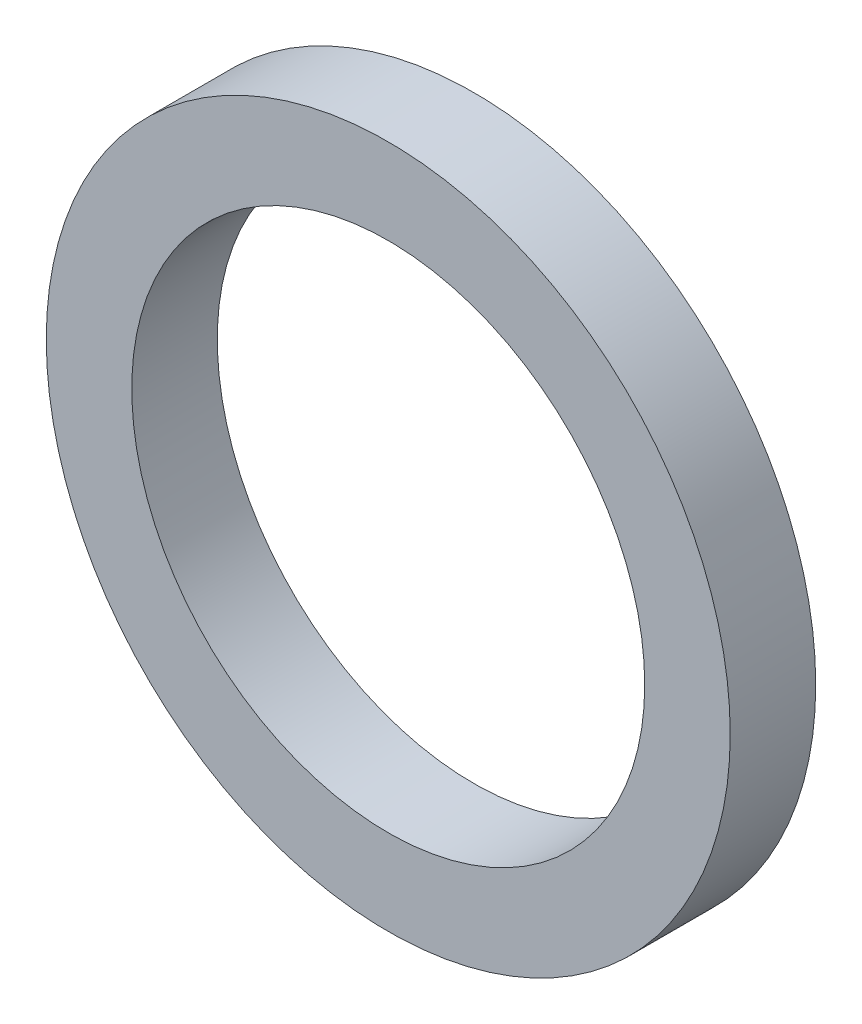
ISO-10303-21;
HEADER;
FILE_DESCRIPTION(('STEP AP214'),'2;1');
FILE_NAME('part.step','',(''),(''),'','','');
FILE_SCHEMA(('AUTOMOTIVE_DESIGN { 1 0 10303 214 1 1 1 1 }'));
ENDSEC;
DATA;
#1=APPLICATION_CONTEXT('core data for automotive mechanical design processes');
#2=APPLICATION_PROTOCOL_DEFINITION('international standard','automotive_design',2000,#1);
#3=PRODUCT_CONTEXT('',#1,'mechanical');
#4=PRODUCT('Part','Part','',(#3));
#5=PRODUCT_RELATED_PRODUCT_CATEGORY('part','',(#4));
#6=PRODUCT_DEFINITION_FORMATION('','',#4);
#7=PRODUCT_DEFINITION_CONTEXT('part definition',#1,'design');
#8=PRODUCT_DEFINITION('design','',#6,#7);
#9=PRODUCT_DEFINITION_SHAPE('','',#8);
#10=(LENGTH_UNIT() NAMED_UNIT(*) SI_UNIT(.MILLI.,.METRE.));
#11=(NAMED_UNIT(*) PLANE_ANGLE_UNIT() SI_UNIT($,.RADIAN.));
#12=(NAMED_UNIT(*) SI_UNIT($,.STERADIAN.) SOLID_ANGLE_UNIT());
#13=UNCERTAINTY_MEASURE_WITH_UNIT(LENGTH_MEASURE(1.E-05),#10,'distance_accuracy_value','');
#14=(GEOMETRIC_REPRESENTATION_CONTEXT(3) GLOBAL_UNCERTAINTY_ASSIGNED_CONTEXT((#13)) GLOBAL_UNIT_ASSIGNED_CONTEXT((#10,
#11,#12)) REPRESENTATION_CONTEXT('',''));
#15=CARTESIAN_POINT('',(0.,0.,0.));
#16=DIRECTION('',(0.,0.,1.));
#17=DIRECTION('',(1.,0.,0.));
#18=AXIS2_PLACEMENT_3D('',#15,#16,#17);
#19=CARTESIAN_POINT('',(0.,0.,3.175));
#20=DIRECTION('',(0.,0.,-1.));
#21=DIRECTION('',(-1.,0.,0.));
#22=AXIS2_PLACEMENT_3D('',#19,#20,#21);
#23=CYLINDRICAL_SURFACE('',#22,12.7);
#24=CARTESIAN_POINT('',(0.,0.,3.175));
#25=DIRECTION('',(0.,0.,1.));
#26=DIRECTION('',(1.,0.,0.));
#27=AXIS2_PLACEMENT_3D('',#24,#25,#26);
#28=CIRCLE('',#27,12.7);
#29=CARTESIAN_POINT('',(12.7,0.,3.175));
#30=VERTEX_POINT('',#29);
#31=EDGE_CURVE('E10',#30,#30,#28,.T.);
#32=ORIENTED_EDGE('',*,*,#31,.F.);
#33=EDGE_LOOP('',(#32));
#34=FACE_BOUND('',#33,.T.);
#35=CARTESIAN_POINT('',(0.,0.,0.));
#36=DIRECTION('',(0.,0.,1.));
#37=DIRECTION('',(1.,0.,0.));
#38=AXIS2_PLACEMENT_3D('',#35,#36,#37);
#39=CIRCLE('',#38,12.7);
#40=CARTESIAN_POINT('',(12.7,0.,0.));
#41=VERTEX_POINT('',#40);
#42=EDGE_CURVE('E34',#41,#41,#39,.T.);
#43=ORIENTED_EDGE('',*,*,#42,.T.);
#44=EDGE_LOOP('',(#43));
#45=FACE_BOUND('',#44,.T.);
#46=ADVANCED_FACE('F31',(#34,#45),#23,.T.);
#47=CARTESIAN_POINT('',(0.,0.,3.175));
#48=DIRECTION('',(0.,0.,1.));
#49=DIRECTION('',(1.,0.,0.));
#50=AXIS2_PLACEMENT_3D('',#47,#48,#49);
#51=PLANE('',#50);
#52=CARTESIAN_POINT('',(0.,0.,3.175));
#53=DIRECTION('',(0.,0.,1.));
#54=DIRECTION('',(1.,0.,0.));
#55=AXIS2_PLACEMENT_3D('',#52,#53,#54);
#56=CIRCLE('',#55,9.525);
#57=CARTESIAN_POINT('',(9.525,0.,3.175));
#58=VERTEX_POINT('',#57);
#59=EDGE_CURVE('E43',#58,#58,#56,.T.);
#60=ORIENTED_EDGE('',*,*,#59,.F.);
#61=EDGE_LOOP('',(#60));
#62=FACE_BOUND('',#61,.T.);
#63=ORIENTED_EDGE('',*,*,#31,.T.);
#64=EDGE_LOOP('',(#63));
#65=FACE_BOUND('',#64,.T.);
#66=ADVANCED_FACE('F58',(#62,#65),#51,.T.);
#67=CARTESIAN_POINT('',(0.,0.,0.));
#68=DIRECTION('',(0.,0.,1.));
#69=DIRECTION('',(1.,0.,0.));
#70=AXIS2_PLACEMENT_3D('',#67,#68,#69);
#71=PLANE('',#70);
#72=CARTESIAN_POINT('',(0.,0.,0.));
#73=DIRECTION('',(0.,0.,1.));
#74=DIRECTION('',(1.,0.,0.));
#75=AXIS2_PLACEMENT_3D('',#72,#73,#74);
#76=CIRCLE('',#75,9.525);
#77=CARTESIAN_POINT('',(9.525,0.,0.));
#78=VERTEX_POINT('',#77);
#79=EDGE_CURVE('E41',#78,#78,#76,.T.);
#80=ORIENTED_EDGE('',*,*,#79,.T.);
#81=EDGE_LOOP('',(#80));
#82=FACE_BOUND('',#81,.T.);
#83=ORIENTED_EDGE('',*,*,#42,.F.);
#84=EDGE_LOOP('',(#83));
#85=FACE_BOUND('',#84,.T.);
#86=ADVANCED_FACE('F49',(#82,#85),#71,.F.);
#87=CARTESIAN_POINT('',(0.,0.,0.));
#88=DIRECTION('',(0.,0.,1.));
#89=DIRECTION('',(1.,0.,0.));
#90=AXIS2_PLACEMENT_3D('',#87,#88,#89);
#91=CYLINDRICAL_SURFACE('',#90,9.525);
#92=ORIENTED_EDGE('',*,*,#79,.F.);
#93=EDGE_LOOP('',(#92));
#94=FACE_BOUND('',#93,.T.);
#95=ORIENTED_EDGE('',*,*,#59,.T.);
#96=EDGE_LOOP('',(#95));
#97=FACE_BOUND('',#96,.T.);
#98=ADVANCED_FACE('F52',(#94,#97),#91,.F.);
#99=CLOSED_SHELL('',(#46,#66,#86,#98));
#100=MANIFOLD_SOLID_BREP('B2',#99);
#101=ADVANCED_BREP_SHAPE_REPRESENTATION('',(#18,#100),#14);
#102=SHAPE_DEFINITION_REPRESENTATION(#9,#101);
ENDSEC;
END-ISO-10303-21;
